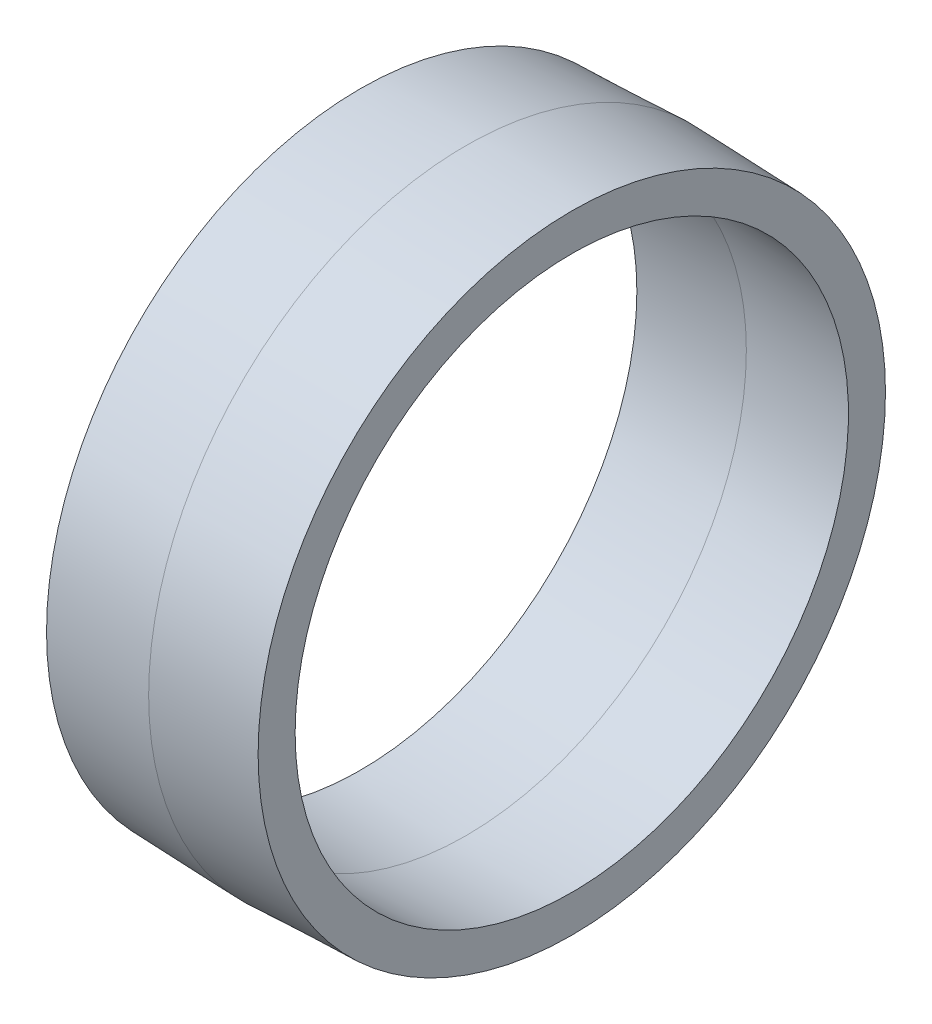
ISO-10303-21;
HEADER;
FILE_DESCRIPTION(('STEP AP214'),'2;1');
FILE_NAME('part.step','',(''),(''),'','','');
FILE_SCHEMA(('AUTOMOTIVE_DESIGN { 1 0 10303 214 1 1 1 1 }'));
ENDSEC;
DATA;
#1=APPLICATION_CONTEXT('core data for automotive mechanical design processes');
#2=APPLICATION_PROTOCOL_DEFINITION('international standard','automotive_design',2000,#1);
#3=PRODUCT_CONTEXT('',#1,'mechanical');
#4=PRODUCT('Part','Part','',(#3));
#5=PRODUCT_RELATED_PRODUCT_CATEGORY('part','',(#4));
#6=PRODUCT_DEFINITION_FORMATION('','',#4);
#7=PRODUCT_DEFINITION_CONTEXT('part definition',#1,'design');
#8=PRODUCT_DEFINITION('design','',#6,#7);
#9=PRODUCT_DEFINITION_SHAPE('','',#8);
#10=(LENGTH_UNIT() NAMED_UNIT(*) SI_UNIT(.MILLI.,.METRE.));
#11=(NAMED_UNIT(*) PLANE_ANGLE_UNIT() SI_UNIT($,.RADIAN.));
#12=(NAMED_UNIT(*) SI_UNIT($,.STERADIAN.) SOLID_ANGLE_UNIT());
#13=UNCERTAINTY_MEASURE_WITH_UNIT(LENGTH_MEASURE(1.E-05),#10,'distance_accuracy_value','');
#14=(GEOMETRIC_REPRESENTATION_CONTEXT(3) GLOBAL_UNCERTAINTY_ASSIGNED_CONTEXT((#13)) GLOBAL_UNIT_ASSIGNED_CONTEXT((#10,
#11,#12)) REPRESENTATION_CONTEXT('',''));
#15=CARTESIAN_POINT('',(0.,0.,0.));
#16=DIRECTION('',(0.,0.,1.));
#17=DIRECTION('',(1.,0.,0.));
#18=AXIS2_PLACEMENT_3D('',#15,#16,#17);
#19=CARTESIAN_POINT('',(-1.22406624605678,0.,0.));
#20=DIRECTION('',(1.,0.,0.));
#21=DIRECTION('',(0.,0.,-1.));
#22=AXIS2_PLACEMENT_3D('',#19,#20,#21);
#23=CONICAL_SURFACE('',#22,33.655,0.0349065850398879);
#24=CARTESIAN_POINT('',(-1.22406624605675,0.,0.));
#25=DIRECTION('',(-1.,0.,0.));
#26=DIRECTION('',(0.,0.,1.));
#27=AXIS2_PLACEMENT_3D('',#24,#25,#26);
#28=CIRCLE('',#27,33.655);
#29=CARTESIAN_POINT('',(-1.22406624605672,0.,33.655));
#30=VERTEX_POINT('',#29);
#31=EDGE_CURVE('E30',#30,#30,#28,.F.);
#32=ORIENTED_EDGE('',*,*,#31,.T.);
#33=EDGE_LOOP('',(#32));
#34=FACE_BOUND('',#33,.T.);
#35=CARTESIAN_POINT('',(-13.9240662460568,0.,0.));
#36=DIRECTION('',(1.,0.,0.));
#37=DIRECTION('',(0.,0.,-1.));
#38=AXIS2_PLACEMENT_3D('',#35,#36,#37);
#39=CIRCLE('',#38,33.2115062274548);
#40=CARTESIAN_POINT('',(-13.9240662460568,0.,-33.2115062274548));
#41=VERTEX_POINT('',#40);
#42=EDGE_CURVE('E18',#41,#41,#39,.T.);
#43=ORIENTED_EDGE('',*,*,#42,.F.);
#44=EDGE_LOOP('',(#43));
#45=FACE_BOUND('',#44,.T.);
#46=ADVANCED_FACE('F15',(#34,#45),#23,.F.);
#47=CARTESIAN_POINT('',(-1.22406624605672,0.,0.));
#48=DIRECTION('',(-1.,0.,0.));
#49=DIRECTION('',(0.,0.,1.));
#50=AXIS2_PLACEMENT_3D('',#47,#48,#49);
#51=CONICAL_SURFACE('',#50,33.655,0.0349065850398875);
#52=CARTESIAN_POINT('',(11.4759337539432,0.,0.));
#53=DIRECTION('',(-1.,0.,0.));
#54=DIRECTION('',(0.,0.,1.));
#55=AXIS2_PLACEMENT_3D('',#52,#53,#54);
#56=CIRCLE('',#55,33.2115062274548);
#57=CARTESIAN_POINT('',(11.4759337539432,0.,33.2115062274548));
#58=VERTEX_POINT('',#57);
#59=EDGE_CURVE('E34',#58,#58,#56,.T.);
#60=ORIENTED_EDGE('',*,*,#59,.F.);
#61=EDGE_LOOP('',(#60));
#62=FACE_BOUND('',#61,.T.);
#63=ORIENTED_EDGE('',*,*,#31,.F.);
#64=EDGE_LOOP('',(#63));
#65=FACE_BOUND('',#64,.T.);
#66=ADVANCED_FACE('F44',(#62,#65),#51,.F.);
#67=CARTESIAN_POINT('',(-13.9240662460568,33.2115062274548,0.));
#68=DIRECTION('',(-1.,0.,0.));
#69=DIRECTION('',(0.,0.,1.));
#70=AXIS2_PLACEMENT_3D('',#67,#68,#69);
#71=PLANE('',#70);
#72=CARTESIAN_POINT('',(-13.9240662460567,0.,0.));
#73=DIRECTION('',(1.,0.,0.));
#74=DIRECTION('',(0.,0.,-1.));
#75=AXIS2_PLACEMENT_3D('',#72,#73,#74);
#76=CIRCLE('',#75,37.6565062274548);
#77=CARTESIAN_POINT('',(-13.9240662460567,0.,-37.6565062274548));
#78=VERTEX_POINT('',#77);
#79=EDGE_CURVE('E27',#78,#78,#76,.T.);
#80=ORIENTED_EDGE('',*,*,#79,.F.);
#81=EDGE_LOOP('',(#80));
#82=FACE_BOUND('',#81,.T.);
#83=ORIENTED_EDGE('',*,*,#42,.T.);
#84=EDGE_LOOP('',(#83));
#85=FACE_BOUND('',#84,.T.);
#86=ADVANCED_FACE('F41',(#82,#85),#71,.T.);
#87=CARTESIAN_POINT('',(11.4759337539432,33.2115062274548,0.));
#88=DIRECTION('',(1.,0.,0.));
#89=DIRECTION('',(0.,0.,-1.));
#90=AXIS2_PLACEMENT_3D('',#87,#88,#89);
#91=PLANE('',#90);
#92=ORIENTED_EDGE('',*,*,#59,.T.);
#93=EDGE_LOOP('',(#92));
#94=FACE_BOUND('',#93,.T.);
#95=CARTESIAN_POINT('',(11.4759337539432,0.,0.));
#96=DIRECTION('',(-1.,0.,0.));
#97=DIRECTION('',(0.,0.,1.));
#98=AXIS2_PLACEMENT_3D('',#95,#96,#97);
#99=CIRCLE('',#98,37.6565062274548);
#100=CARTESIAN_POINT('',(11.4759337539432,0.,37.6565062274548));
#101=VERTEX_POINT('',#100);
#102=EDGE_CURVE('E22',#101,#101,#99,.T.);
#103=ORIENTED_EDGE('',*,*,#102,.F.);
#104=EDGE_LOOP('',(#103));
#105=FACE_BOUND('',#104,.T.);
#106=ADVANCED_FACE('F58',(#94,#105),#91,.T.);
#107=CARTESIAN_POINT('',(-1.22406624605668,0.,0.));
#108=DIRECTION('',(1.,0.,0.));
#109=DIRECTION('',(0.,0.,-1.));
#110=AXIS2_PLACEMENT_3D('',#107,#108,#109);
#111=CONICAL_SURFACE('',#110,38.1,0.034906585039887);
#112=CARTESIAN_POINT('',(-1.22406624605675,0.,0.));
#113=DIRECTION('',(-1.,0.,0.));
#114=DIRECTION('',(0.,0.,1.));
#115=AXIS2_PLACEMENT_3D('',#112,#113,#114);
#116=CIRCLE('',#115,38.1);
#117=CARTESIAN_POINT('',(-1.22406624605683,0.,38.1));
#118=VERTEX_POINT('',#117);
#119=EDGE_CURVE('E10',#118,#118,#116,.F.);
#120=ORIENTED_EDGE('',*,*,#119,.F.);
#121=EDGE_LOOP('',(#120));
#122=FACE_BOUND('',#121,.T.);
#123=ORIENTED_EDGE('',*,*,#79,.T.);
#124=EDGE_LOOP('',(#123));
#125=FACE_BOUND('',#124,.T.);
#126=ADVANCED_FACE('F53',(#122,#125),#111,.T.);
#127=CARTESIAN_POINT('',(-1.22406624605683,0.,0.));
#128=DIRECTION('',(-1.,0.,0.));
#129=DIRECTION('',(0.,0.,1.));
#130=AXIS2_PLACEMENT_3D('',#127,#128,#129);
#131=CONICAL_SURFACE('',#130,38.1,0.0349065850398862);
#132=ORIENTED_EDGE('',*,*,#119,.T.);
#133=EDGE_LOOP('',(#132));
#134=FACE_BOUND('',#133,.T.);
#135=ORIENTED_EDGE('',*,*,#102,.T.);
#136=EDGE_LOOP('',(#135));
#137=FACE_BOUND('',#136,.T.);
#138=ADVANCED_FACE('F51',(#134,#137),#131,.T.);
#139=CLOSED_SHELL('',(#46,#66,#86,#106,#126,#138));
#140=MANIFOLD_SOLID_BREP('B1',#139);
#141=ADVANCED_BREP_SHAPE_REPRESENTATION('',(#18,#140),#14);
#142=SHAPE_DEFINITION_REPRESENTATION(#9,#141);
ENDSEC;
END-ISO-10303-21;
